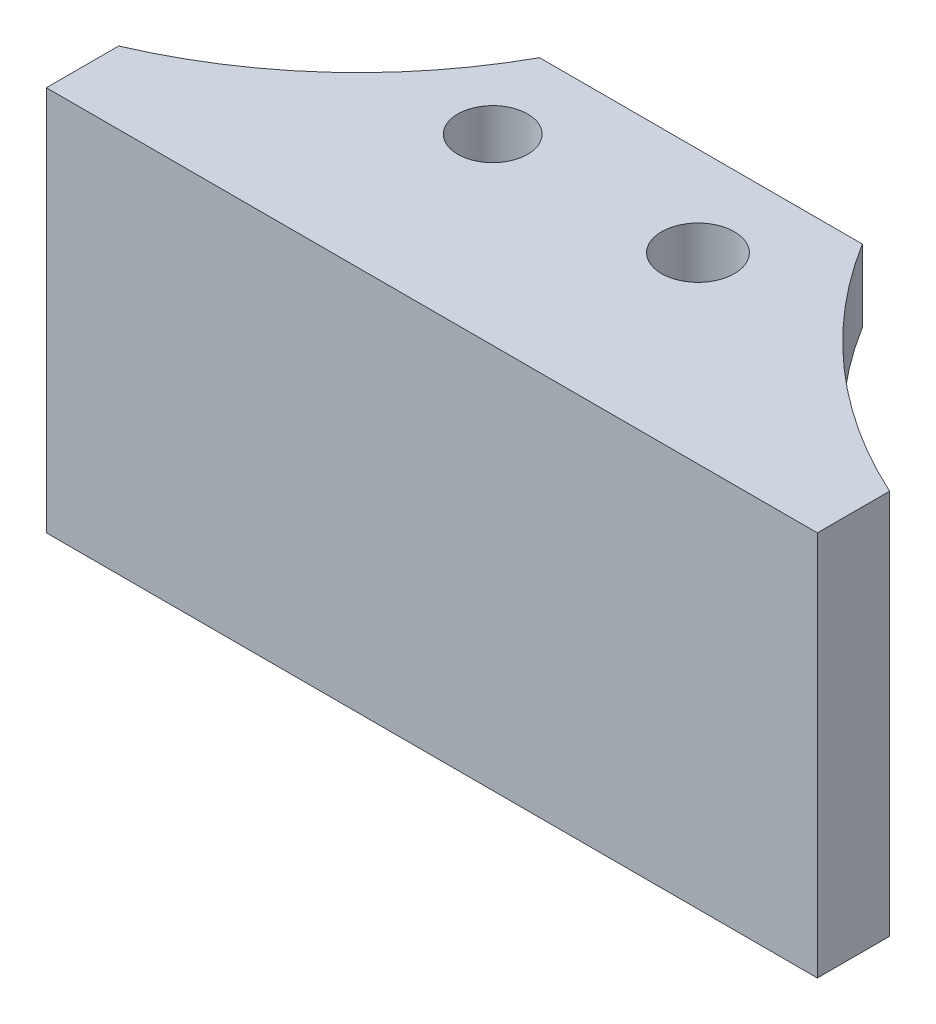
ISO-10303-21;
HEADER;
FILE_DESCRIPTION(('STEP AP214'),'2;1');
FILE_NAME('part.step','',(''),(''),'','','');
FILE_SCHEMA(('AUTOMOTIVE_DESIGN { 1 0 10303 214 1 1 1 1 }'));
ENDSEC;
DATA;
#1=APPLICATION_CONTEXT('core data for automotive mechanical design processes');
#2=APPLICATION_PROTOCOL_DEFINITION('international standard','automotive_design',2000,#1);
#3=PRODUCT_CONTEXT('',#1,'mechanical');
#4=PRODUCT('Part','Part','',(#3));
#5=PRODUCT_RELATED_PRODUCT_CATEGORY('part','',(#4));
#6=PRODUCT_DEFINITION_FORMATION('','',#4);
#7=PRODUCT_DEFINITION_CONTEXT('part definition',#1,'design');
#8=PRODUCT_DEFINITION('design','',#6,#7);
#9=PRODUCT_DEFINITION_SHAPE('','',#8);
#10=(LENGTH_UNIT() NAMED_UNIT(*) SI_UNIT(.MILLI.,.METRE.));
#11=(NAMED_UNIT(*) PLANE_ANGLE_UNIT() SI_UNIT($,.RADIAN.));
#12=(NAMED_UNIT(*) SI_UNIT($,.STERADIAN.) SOLID_ANGLE_UNIT());
#13=UNCERTAINTY_MEASURE_WITH_UNIT(LENGTH_MEASURE(1.E-05),#10,'distance_accuracy_value','');
#14=(GEOMETRIC_REPRESENTATION_CONTEXT(3) GLOBAL_UNCERTAINTY_ASSIGNED_CONTEXT((#13)) GLOBAL_UNIT_ASSIGNED_CONTEXT((#10,
#11,#12)) REPRESENTATION_CONTEXT('',''));
#15=CARTESIAN_POINT('',(0.,0.,0.));
#16=DIRECTION('',(0.,0.,1.));
#17=DIRECTION('',(1.,0.,0.));
#18=AXIS2_PLACEMENT_3D('',#15,#16,#17);
#19=CARTESIAN_POINT('',(0.,0.,0.));
#20=DIRECTION('',(0.,0.,1.));
#21=DIRECTION('',(1.,0.,0.));
#22=AXIS2_PLACEMENT_3D('',#19,#20,#21);
#23=PLANE('',#22);
#24=DIRECTION('',(-1.,0.,0.));
#25=VECTOR('',#24,1.);
#26=CARTESIAN_POINT('',(0.,65.,0.));
#27=LINE('',#26,#25);
#28=CARTESIAN_POINT('',(160.,65.,0.));
#29=VERTEX_POINT('',#28);
#30=CARTESIAN_POINT('',(0.,65.,0.));
#31=VERTEX_POINT('',#30);
#32=EDGE_CURVE('E52',#29,#31,#27,.T.);
#33=ORIENTED_EDGE('',*,*,#32,.F.);
#34=DIRECTION('',(0.,1.,0.));
#35=VECTOR('',#34,1.);
#36=CARTESIAN_POINT('',(160.,0.,0.));
#37=LINE('',#36,#35);
#38=CARTESIAN_POINT('',(160.,0.,0.));
#39=VERTEX_POINT('',#38);
#40=EDGE_CURVE('E149',#39,#29,#37,.T.);
#41=ORIENTED_EDGE('',*,*,#40,.F.);
#42=DIRECTION('',(1.,0.,0.));
#43=VECTOR('',#42,1.);
#44=CARTESIAN_POINT('',(0.,0.,0.));
#45=LINE('',#44,#43);
#46=CARTESIAN_POINT('',(0.,0.,0.));
#47=VERTEX_POINT('',#46);
#48=EDGE_CURVE('E162',#47,#39,#45,.T.);
#49=ORIENTED_EDGE('',*,*,#48,.F.);
#50=DIRECTION('',(0.,1.,0.));
#51=VECTOR('',#50,1.);
#52=CARTESIAN_POINT('',(0.,0.,0.));
#53=LINE('',#52,#51);
#54=EDGE_CURVE('E155',#47,#31,#53,.T.);
#55=ORIENTED_EDGE('',*,*,#54,.T.);
#56=EDGE_LOOP('',(#33,#41,#49,#55));
#57=FACE_BOUND('',#56,.T.);
#58=ADVANCED_FACE('F35',(#57),#23,.F.);
#59=CARTESIAN_POINT('',(0.,80.,15.));
#60=DIRECTION('',(0.,1.,0.));
#61=DIRECTION('',(0.,0.,1.));
#62=AXIS2_PLACEMENT_3D('',#59,#60,#61);
#63=PLANE('',#62);
#64=DIRECTION('',(0.,0.,-1.));
#65=VECTOR('',#64,1.);
#66=CARTESIAN_POINT('',(160.,80.,15.));
#67=LINE('',#66,#65);
#68=CARTESIAN_POINT('',(160.,80.,15.));
#69=VERTEX_POINT('',#68);
#70=CARTESIAN_POINT('',(160.,80.,0.));
#71=VERTEX_POINT('',#70);
#72=EDGE_CURVE('E39',#69,#71,#67,.T.);
#73=ORIENTED_EDGE('',*,*,#72,.T.);
#74=CARTESIAN_POINT('',(204.714932516592,80.,-98.4205874204378));
#75=DIRECTION('',(0.,1.,0.));
#76=DIRECTION('',(0.,0.,1.));
#77=AXIS2_PLACEMENT_3D('',#74,#75,#76);
#78=CIRCLE('',#77,108.101976014074);
#79=CARTESIAN_POINT('',(112.76566005451,80.,-41.5754599965213));
#80=VERTEX_POINT('',#79);
#81=EDGE_CURVE('E143',#80,#71,#78,.T.);
#82=ORIENTED_EDGE('',*,*,#81,.F.);
#83=DIRECTION('',(1.,0.,0.));
#84=VECTOR('',#83,1.);
#85=CARTESIAN_POINT('',(0.,80.,-41.5754599965213));
#86=LINE('',#85,#84);
#87=CARTESIAN_POINT('',(45.7787929317392,80.,-41.5754599965213));
#88=VERTEX_POINT('',#87);
#89=EDGE_CURVE('E120',#88,#80,#86,.T.);
#90=ORIENTED_EDGE('',*,*,#89,.F.);
#91=CARTESIAN_POINT('',(-37.4103305705639,80.,-87.1838376558128));
#92=DIRECTION('',(0.,1.,0.));
#93=DIRECTION('',(0.,0.,1.));
#94=AXIS2_PLACEMENT_3D('',#91,#92,#93);
#95=CIRCLE('',#94,94.8712516086617);
#96=CARTESIAN_POINT('',(0.,80.,0.));
#97=VERTEX_POINT('',#96);
#98=EDGE_CURVE('E146',#97,#88,#95,.T.);
#99=ORIENTED_EDGE('',*,*,#98,.F.);
#100=DIRECTION('',(0.,0.,-1.));
#101=VECTOR('',#100,1.);
#102=CARTESIAN_POINT('',(0.,80.,15.));
#103=LINE('',#102,#101);
#104=CARTESIAN_POINT('',(0.,80.,15.));
#105=VERTEX_POINT('',#104);
#106=EDGE_CURVE('E11',#105,#97,#103,.T.);
#107=ORIENTED_EDGE('',*,*,#106,.F.);
#108=DIRECTION('',(1.,0.,0.));
#109=VECTOR('',#108,1.);
#110=CARTESIAN_POINT('',(0.,80.,15.));
#111=LINE('',#110,#109);
#112=EDGE_CURVE('E153',#105,#69,#111,.T.);
#113=ORIENTED_EDGE('',*,*,#112,.T.);
#114=EDGE_LOOP('',(#73,#82,#90,#99,#107,#113));
#115=FACE_BOUND('',#114,.T.);
#116=CARTESIAN_POINT('',(97.2573046141612,80.,-22.9699284593787));
#117=DIRECTION('',(0.,1.,0.));
#118=DIRECTION('',(0.,0.,1.));
#119=AXIS2_PLACEMENT_3D('',#116,#117,#118);
#120=CIRCLE('',#119,7.55007076869555);
#121=CARTESIAN_POINT('',(97.2573046141612,80.,-15.4198576906832));
#122=VERTEX_POINT('',#121);
#123=EDGE_CURVE('E137',#122,#122,#120,.T.);
#124=ORIENTED_EDGE('',*,*,#123,.F.);
#125=EDGE_LOOP('',(#124));
#126=FACE_BOUND('',#125,.T.);
#127=CARTESIAN_POINT('',(54.6533338479507,80.,-22.9699284593787));
#128=DIRECTION('',(0.,1.,0.));
#129=DIRECTION('',(0.,0.,1.));
#130=AXIS2_PLACEMENT_3D('',#127,#128,#129);
#131=CIRCLE('',#130,7.25541526077363);
#132=CARTESIAN_POINT('',(54.6533338479507,80.,-15.7145131986051));
#133=VERTEX_POINT('',#132);
#134=EDGE_CURVE('E140',#133,#133,#131,.T.);
#135=ORIENTED_EDGE('',*,*,#134,.F.);
#136=EDGE_LOOP('',(#135));
#137=FACE_BOUND('',#136,.T.);
#138=ADVANCED_FACE('F37',(#115,#126,#137),#63,.T.);
#139=CARTESIAN_POINT('',(0.,0.,15.));
#140=DIRECTION('',(-1.,0.,0.));
#141=DIRECTION('',(0.,0.,1.));
#142=AXIS2_PLACEMENT_3D('',#139,#140,#141);
#143=PLANE('',#142);
#144=ORIENTED_EDGE('',*,*,#54,.F.);
#145=DIRECTION('',(0.,0.,-1.));
#146=VECTOR('',#145,1.);
#147=CARTESIAN_POINT('',(0.,0.,15.));
#148=LINE('',#147,#146);
#149=CARTESIAN_POINT('',(0.,0.,15.));
#150=VERTEX_POINT('',#149);
#151=EDGE_CURVE('E44',#150,#47,#148,.T.);
#152=ORIENTED_EDGE('',*,*,#151,.F.);
#153=DIRECTION('',(0.,1.,0.));
#154=VECTOR('',#153,1.);
#155=CARTESIAN_POINT('',(0.,0.,15.));
#156=LINE('',#155,#154);
#157=EDGE_CURVE('E159',#150,#105,#156,.T.);
#158=ORIENTED_EDGE('',*,*,#157,.T.);
#159=ORIENTED_EDGE('',*,*,#106,.T.);
#160=DIRECTION('',(0.,1.,0.));
#161=VECTOR('',#160,1.);
#162=CARTESIAN_POINT('',(0.,65.,0.));
#163=LINE('',#162,#161);
#164=EDGE_CURVE('E150',#31,#97,#163,.T.);
#165=ORIENTED_EDGE('',*,*,#164,.F.);
#166=EDGE_LOOP('',(#144,#152,#158,#159,#165));
#167=FACE_BOUND('',#166,.T.);
#168=ADVANCED_FACE('F175',(#167),#143,.T.);
#169=CARTESIAN_POINT('',(0.,0.,15.));
#170=DIRECTION('',(0.,1.,0.));
#171=DIRECTION('',(0.,0.,1.));
#172=AXIS2_PLACEMENT_3D('',#169,#170,#171);
#173=PLANE('',#172);
#174=ORIENTED_EDGE('',*,*,#48,.T.);
#175=DIRECTION('',(0.,0.,-1.));
#176=VECTOR('',#175,1.);
#177=CARTESIAN_POINT('',(160.,0.,15.));
#178=LINE('',#177,#176);
#179=CARTESIAN_POINT('',(160.,0.,15.));
#180=VERTEX_POINT('',#179);
#181=EDGE_CURVE('E165',#180,#39,#178,.T.);
#182=ORIENTED_EDGE('',*,*,#181,.F.);
#183=DIRECTION('',(1.,0.,0.));
#184=VECTOR('',#183,1.);
#185=CARTESIAN_POINT('',(0.,0.,15.));
#186=LINE('',#185,#184);
#187=EDGE_CURVE('E157',#150,#180,#186,.T.);
#188=ORIENTED_EDGE('',*,*,#187,.F.);
#189=ORIENTED_EDGE('',*,*,#151,.T.);
#190=EDGE_LOOP('',(#174,#182,#188,#189));
#191=FACE_BOUND('',#190,.T.);
#192=ADVANCED_FACE('F203',(#191),#173,.F.);
#193=CARTESIAN_POINT('',(160.,0.,15.));
#194=DIRECTION('',(-1.,0.,0.));
#195=DIRECTION('',(0.,0.,1.));
#196=AXIS2_PLACEMENT_3D('',#193,#194,#195);
#197=PLANE('',#196);
#198=ORIENTED_EDGE('',*,*,#40,.T.);
#199=DIRECTION('',(0.,1.,0.));
#200=VECTOR('',#199,1.);
#201=CARTESIAN_POINT('',(160.,65.,0.));
#202=LINE('',#201,#200);
#203=EDGE_CURVE('E127',#29,#71,#202,.T.);
#204=ORIENTED_EDGE('',*,*,#203,.T.);
#205=ORIENTED_EDGE('',*,*,#72,.F.);
#206=DIRECTION('',(0.,1.,0.));
#207=VECTOR('',#206,1.);
#208=CARTESIAN_POINT('',(160.,0.,15.));
#209=LINE('',#208,#207);
#210=EDGE_CURVE('E86',#180,#69,#209,.T.);
#211=ORIENTED_EDGE('',*,*,#210,.F.);
#212=ORIENTED_EDGE('',*,*,#181,.T.);
#213=EDGE_LOOP('',(#198,#204,#205,#211,#212));
#214=FACE_BOUND('',#213,.T.);
#215=ADVANCED_FACE('F171',(#214),#197,.F.);
#216=CARTESIAN_POINT('',(0.,0.,15.));
#217=DIRECTION('',(0.,0.,1.));
#218=DIRECTION('',(1.,0.,0.));
#219=AXIS2_PLACEMENT_3D('',#216,#217,#218);
#220=PLANE('',#219);
#221=ORIENTED_EDGE('',*,*,#112,.F.);
#222=ORIENTED_EDGE('',*,*,#157,.F.);
#223=ORIENTED_EDGE('',*,*,#187,.T.);
#224=ORIENTED_EDGE('',*,*,#210,.T.);
#225=EDGE_LOOP('',(#221,#222,#223,#224));
#226=FACE_BOUND('',#225,.T.);
#227=ADVANCED_FACE('F189',(#226),#220,.T.);
#228=CARTESIAN_POINT('',(204.714932516592,65.,-98.4205874204378));
#229=DIRECTION('',(0.,1.,0.));
#230=DIRECTION('',(0.,0.,1.));
#231=AXIS2_PLACEMENT_3D('',#228,#229,#230);
#232=CYLINDRICAL_SURFACE('',#231,108.101976014074);
#233=ORIENTED_EDGE('',*,*,#81,.T.);
#234=ORIENTED_EDGE('',*,*,#203,.F.);
#235=CARTESIAN_POINT('',(204.714932516592,65.,-98.4205874204378));
#236=DIRECTION('',(0.,1.,0.));
#237=DIRECTION('',(0.,0.,1.));
#238=AXIS2_PLACEMENT_3D('',#235,#236,#237);
#239=CIRCLE('',#238,108.101976014074);
#240=CARTESIAN_POINT('',(112.76566005451,65.,-41.5754599965213));
#241=VERTEX_POINT('',#240);
#242=EDGE_CURVE('E108',#241,#29,#239,.T.);
#243=ORIENTED_EDGE('',*,*,#242,.F.);
#244=DIRECTION('',(0.,1.,0.));
#245=VECTOR('',#244,1.);
#246=CARTESIAN_POINT('',(112.76566005451,65.,-41.5754599965213));
#247=LINE('',#246,#245);
#248=EDGE_CURVE('E117',#241,#80,#247,.T.);
#249=ORIENTED_EDGE('',*,*,#248,.T.);
#250=EDGE_LOOP('',(#233,#234,#243,#249));
#251=FACE_BOUND('',#250,.T.);
#252=ADVANCED_FACE('F126',(#251),#232,.F.);
#253=CARTESIAN_POINT('',(-37.4103305705639,65.,-87.1838376558128));
#254=DIRECTION('',(0.,1.,0.));
#255=DIRECTION('',(0.,0.,1.));
#256=AXIS2_PLACEMENT_3D('',#253,#254,#255);
#257=CYLINDRICAL_SURFACE('',#256,94.8712516086617);
#258=ORIENTED_EDGE('',*,*,#98,.T.);
#259=DIRECTION('',(0.,1.,0.));
#260=VECTOR('',#259,1.);
#261=CARTESIAN_POINT('',(45.7787929317392,65.,-41.5754599965213));
#262=LINE('',#261,#260);
#263=CARTESIAN_POINT('',(45.7787929317392,65.,-41.5754599965213));
#264=VERTEX_POINT('',#263);
#265=EDGE_CURVE('E124',#264,#88,#262,.T.);
#266=ORIENTED_EDGE('',*,*,#265,.F.);
#267=CARTESIAN_POINT('',(-37.4103305705639,65.,-87.1838376558128));
#268=DIRECTION('',(0.,1.,0.));
#269=DIRECTION('',(0.,0.,1.));
#270=AXIS2_PLACEMENT_3D('',#267,#268,#269);
#271=CIRCLE('',#270,94.8712516086617);
#272=EDGE_CURVE('E111',#31,#264,#271,.T.);
#273=ORIENTED_EDGE('',*,*,#272,.F.);
#274=ORIENTED_EDGE('',*,*,#164,.T.);
#275=EDGE_LOOP('',(#258,#266,#273,#274));
#276=FACE_BOUND('',#275,.T.);
#277=ADVANCED_FACE('F178',(#276),#257,.F.);
#278=CARTESIAN_POINT('',(54.6533338479507,65.,-22.9699284593787));
#279=DIRECTION('',(0.,1.,0.));
#280=DIRECTION('',(0.,0.,1.));
#281=AXIS2_PLACEMENT_3D('',#278,#279,#280);
#282=CYLINDRICAL_SURFACE('',#281,7.25541526077363);
#283=CARTESIAN_POINT('',(54.6533338479507,65.,-22.9699284593787));
#284=DIRECTION('',(0.,1.,0.));
#285=DIRECTION('',(0.,0.,1.));
#286=AXIS2_PLACEMENT_3D('',#283,#284,#285);
#287=CIRCLE('',#286,7.25541526077363);
#288=CARTESIAN_POINT('',(54.6533338479507,65.,-15.7145131986051));
#289=VERTEX_POINT('',#288);
#290=EDGE_CURVE('E128',#289,#289,#287,.T.);
#291=ORIENTED_EDGE('',*,*,#290,.F.);
#292=EDGE_LOOP('',(#291));
#293=FACE_BOUND('',#292,.T.);
#294=ORIENTED_EDGE('',*,*,#134,.T.);
#295=EDGE_LOOP('',(#294));
#296=FACE_BOUND('',#295,.T.);
#297=ADVANCED_FACE('F180',(#293,#296),#282,.F.);
#298=CARTESIAN_POINT('',(97.2573046141612,65.,-22.9699284593787));
#299=DIRECTION('',(0.,1.,0.));
#300=DIRECTION('',(0.,0.,1.));
#301=AXIS2_PLACEMENT_3D('',#298,#299,#300);
#302=CYLINDRICAL_SURFACE('',#301,7.55007076869555);
#303=CARTESIAN_POINT('',(97.2573046141612,65.,-22.9699284593787));
#304=DIRECTION('',(0.,1.,0.));
#305=DIRECTION('',(0.,0.,1.));
#306=AXIS2_PLACEMENT_3D('',#303,#304,#305);
#307=CIRCLE('',#306,7.55007076869555);
#308=CARTESIAN_POINT('',(97.2573046141612,65.,-15.4198576906832));
#309=VERTEX_POINT('',#308);
#310=EDGE_CURVE('E131',#309,#309,#307,.T.);
#311=ORIENTED_EDGE('',*,*,#310,.F.);
#312=EDGE_LOOP('',(#311));
#313=FACE_BOUND('',#312,.T.);
#314=ORIENTED_EDGE('',*,*,#123,.T.);
#315=EDGE_LOOP('',(#314));
#316=FACE_BOUND('',#315,.T.);
#317=ADVANCED_FACE('F186',(#313,#316),#302,.F.);
#318=CARTESIAN_POINT('',(0.,65.,-41.5754599965213));
#319=DIRECTION('',(0.,0.,1.));
#320=DIRECTION('',(1.,0.,0.));
#321=AXIS2_PLACEMENT_3D('',#318,#319,#320);
#322=PLANE('',#321);
#323=ORIENTED_EDGE('',*,*,#89,.T.);
#324=ORIENTED_EDGE('',*,*,#248,.F.);
#325=DIRECTION('',(1.,0.,0.));
#326=VECTOR('',#325,1.);
#327=CARTESIAN_POINT('',(0.,65.,-41.5754599965213));
#328=LINE('',#327,#326);
#329=EDGE_CURVE('E104',#264,#241,#328,.T.);
#330=ORIENTED_EDGE('',*,*,#329,.F.);
#331=ORIENTED_EDGE('',*,*,#265,.T.);
#332=EDGE_LOOP('',(#323,#324,#330,#331));
#333=FACE_BOUND('',#332,.T.);
#334=ADVANCED_FACE('F118',(#333),#322,.F.);
#335=CARTESIAN_POINT('',(0.,65.,0.));
#336=DIRECTION('',(0.,1.,0.));
#337=DIRECTION('',(0.,0.,1.));
#338=AXIS2_PLACEMENT_3D('',#335,#336,#337);
#339=PLANE('',#338);
#340=ORIENTED_EDGE('',*,*,#310,.T.);
#341=EDGE_LOOP('',(#340));
#342=FACE_BOUND('',#341,.T.);
#343=ORIENTED_EDGE('',*,*,#290,.T.);
#344=EDGE_LOOP('',(#343));
#345=FACE_BOUND('',#344,.T.);
#346=ORIENTED_EDGE('',*,*,#242,.T.);
#347=ORIENTED_EDGE('',*,*,#32,.T.);
#348=ORIENTED_EDGE('',*,*,#272,.T.);
#349=ORIENTED_EDGE('',*,*,#329,.T.);
#350=EDGE_LOOP('',(#346,#347,#348,#349));
#351=FACE_BOUND('',#350,.T.);
#352=ADVANCED_FACE('F106',(#342,#345,#351),#339,.F.);
#353=CLOSED_SHELL('',(#58,#138,#168,#192,#215,#227,#252,#277,#297,#317,#334,#352));
#354=MANIFOLD_SOLID_BREP('B2',#353);
#355=ADVANCED_BREP_SHAPE_REPRESENTATION('',(#18,#354),#14);
#356=SHAPE_DEFINITION_REPRESENTATION(#9,#355);
ENDSEC;
END-ISO-10303-21;
